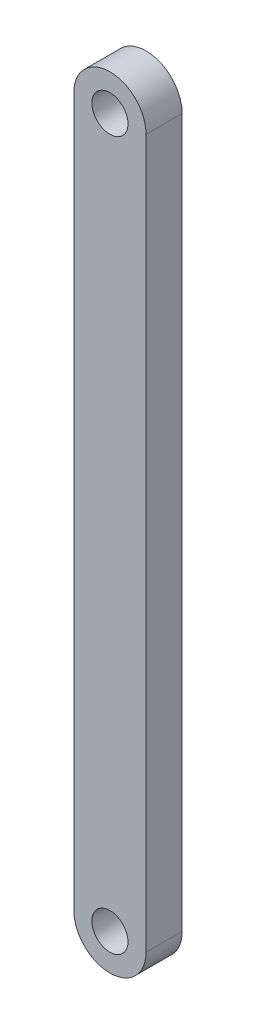
ISO-10303-21;
HEADER;
FILE_DESCRIPTION(('STEP AP214'),'2;1');
FILE_NAME('part.step','',(''),(''),'','','');
FILE_SCHEMA(('AUTOMOTIVE_DESIGN { 1 0 10303 214 1 1 1 1 }'));
ENDSEC;
DATA;
#1=APPLICATION_CONTEXT('core data for automotive mechanical design processes');
#2=APPLICATION_PROTOCOL_DEFINITION('international standard','automotive_design',2000,#1);
#3=PRODUCT_CONTEXT('',#1,'mechanical');
#4=PRODUCT('Part','Part','',(#3));
#5=PRODUCT_RELATED_PRODUCT_CATEGORY('part','',(#4));
#6=PRODUCT_DEFINITION_FORMATION('','',#4);
#7=PRODUCT_DEFINITION_CONTEXT('part definition',#1,'design');
#8=PRODUCT_DEFINITION('design','',#6,#7);
#9=PRODUCT_DEFINITION_SHAPE('','',#8);
#10=(LENGTH_UNIT() NAMED_UNIT(*) SI_UNIT(.MILLI.,.METRE.));
#11=(NAMED_UNIT(*) PLANE_ANGLE_UNIT() SI_UNIT($,.RADIAN.));
#12=(NAMED_UNIT(*) SI_UNIT($,.STERADIAN.) SOLID_ANGLE_UNIT());
#13=UNCERTAINTY_MEASURE_WITH_UNIT(LENGTH_MEASURE(1.E-05),#10,'distance_accuracy_value','');
#14=(GEOMETRIC_REPRESENTATION_CONTEXT(3) GLOBAL_UNCERTAINTY_ASSIGNED_CONTEXT((#13)) GLOBAL_UNIT_ASSIGNED_CONTEXT((#10,
#11,#12)) REPRESENTATION_CONTEXT('',''));
#15=CARTESIAN_POINT('',(0.,0.,0.));
#16=DIRECTION('',(0.,0.,1.));
#17=DIRECTION('',(1.,0.,0.));
#18=AXIS2_PLACEMENT_3D('',#15,#16,#17);
#19=CARTESIAN_POINT('',(0.,0.,6.));
#20=DIRECTION('',(0.,0.,1.));
#21=DIRECTION('',(1.,0.,0.));
#22=AXIS2_PLACEMENT_3D('',#19,#20,#21);
#23=PLANE('',#22);
#24=CARTESIAN_POINT('',(0.,0.,6.));
#25=DIRECTION('',(0.,0.,1.));
#26=DIRECTION('',(1.,0.,0.));
#27=AXIS2_PLACEMENT_3D('',#24,#25,#26);
#28=CIRCLE('',#27,3.);
#29=CARTESIAN_POINT('',(3.,0.,6.));
#30=VERTEX_POINT('',#29);
#31=EDGE_CURVE('E100',#30,#30,#28,.T.);
#32=ORIENTED_EDGE('',*,*,#31,.F.);
#33=EDGE_LOOP('',(#32));
#34=FACE_BOUND('',#33,.T.);
#35=CARTESIAN_POINT('',(0.,0.,6.));
#36=DIRECTION('',(0.,0.,1.));
#37=DIRECTION('',(1.,0.,0.));
#38=AXIS2_PLACEMENT_3D('',#35,#36,#37);
#39=CIRCLE('',#38,6.);
#40=CARTESIAN_POINT('',(-6.,0.,6.));
#41=VERTEX_POINT('',#40);
#42=CARTESIAN_POINT('',(6.,0.,6.));
#43=VERTEX_POINT('',#42);
#44=EDGE_CURVE('E85',#41,#43,#39,.T.);
#45=ORIENTED_EDGE('',*,*,#44,.T.);
#46=DIRECTION('',(0.,1.,0.));
#47=VECTOR('',#46,1.);
#48=CARTESIAN_POINT('',(6.,0.,6.));
#49=LINE('',#48,#47);
#50=CARTESIAN_POINT('',(6.,117.69,6.));
#51=VERTEX_POINT('',#50);
#52=EDGE_CURVE('E80',#43,#51,#49,.T.);
#53=ORIENTED_EDGE('',*,*,#52,.T.);
#54=CARTESIAN_POINT('',(0.,117.69,6.));
#55=DIRECTION('',(0.,0.,1.));
#56=DIRECTION('',(1.,0.,0.));
#57=AXIS2_PLACEMENT_3D('',#54,#55,#56);
#58=CIRCLE('',#57,6.);
#59=CARTESIAN_POINT('',(-6.,117.69,6.));
#60=VERTEX_POINT('',#59);
#61=EDGE_CURVE('E83',#51,#60,#58,.T.);
#62=ORIENTED_EDGE('',*,*,#61,.T.);
#63=DIRECTION('',(0.,-1.,0.));
#64=VECTOR('',#63,1.);
#65=CARTESIAN_POINT('',(-6.,0.,6.));
#66=LINE('',#65,#64);
#67=EDGE_CURVE('E50',#60,#41,#66,.T.);
#68=ORIENTED_EDGE('',*,*,#67,.T.);
#69=EDGE_LOOP('',(#45,#53,#62,#68));
#70=FACE_BOUND('',#69,.T.);
#71=CARTESIAN_POINT('',(0.,117.69,6.));
#72=DIRECTION('',(0.,0.,1.));
#73=DIRECTION('',(1.,0.,0.));
#74=AXIS2_PLACEMENT_3D('',#71,#72,#73);
#75=CIRCLE('',#74,3.);
#76=CARTESIAN_POINT('',(3.,117.69,6.));
#77=VERTEX_POINT('',#76);
#78=EDGE_CURVE('E115',#77,#77,#75,.T.);
#79=ORIENTED_EDGE('',*,*,#78,.F.);
#80=EDGE_LOOP('',(#79));
#81=FACE_BOUND('',#80,.T.);
#82=ADVANCED_FACE('F33',(#34,#70,#81),#23,.T.);
#83=CARTESIAN_POINT('',(0.,0.,0.));
#84=DIRECTION('',(0.,0.,1.));
#85=DIRECTION('',(1.,0.,0.));
#86=AXIS2_PLACEMENT_3D('',#83,#84,#85);
#87=PLANE('',#86);
#88=CARTESIAN_POINT('',(0.,0.,0.));
#89=DIRECTION('',(0.,0.,1.));
#90=DIRECTION('',(1.,0.,0.));
#91=AXIS2_PLACEMENT_3D('',#88,#89,#90);
#92=CIRCLE('',#91,6.);
#93=CARTESIAN_POINT('',(-6.,0.,0.));
#94=VERTEX_POINT('',#93);
#95=CARTESIAN_POINT('',(6.,0.,0.));
#96=VERTEX_POINT('',#95);
#97=EDGE_CURVE('E97',#94,#96,#92,.T.);
#98=ORIENTED_EDGE('',*,*,#97,.F.);
#99=DIRECTION('',(0.,-1.,0.));
#100=VECTOR('',#99,1.);
#101=CARTESIAN_POINT('',(-6.,0.,0.));
#102=LINE('',#101,#100);
#103=CARTESIAN_POINT('',(-6.,117.69,0.));
#104=VERTEX_POINT('',#103);
#105=EDGE_CURVE('E73',#104,#94,#102,.T.);
#106=ORIENTED_EDGE('',*,*,#105,.F.);
#107=CARTESIAN_POINT('',(0.,117.69,0.));
#108=DIRECTION('',(0.,0.,1.));
#109=DIRECTION('',(1.,0.,0.));
#110=AXIS2_PLACEMENT_3D('',#107,#108,#109);
#111=CIRCLE('',#110,6.);
#112=CARTESIAN_POINT('',(6.,117.69,0.));
#113=VERTEX_POINT('',#112);
#114=EDGE_CURVE('E67',#113,#104,#111,.T.);
#115=ORIENTED_EDGE('',*,*,#114,.F.);
#116=DIRECTION('',(0.,1.,0.));
#117=VECTOR('',#116,1.);
#118=CARTESIAN_POINT('',(6.,0.,0.));
#119=LINE('',#118,#117);
#120=EDGE_CURVE('E89',#96,#113,#119,.T.);
#121=ORIENTED_EDGE('',*,*,#120,.F.);
#122=EDGE_LOOP('',(#98,#106,#115,#121));
#123=FACE_BOUND('',#122,.T.);
#124=CARTESIAN_POINT('',(0.,0.,0.));
#125=DIRECTION('',(0.,0.,1.));
#126=DIRECTION('',(1.,0.,0.));
#127=AXIS2_PLACEMENT_3D('',#124,#125,#126);
#128=CIRCLE('',#127,3.);
#129=CARTESIAN_POINT('',(3.,0.,0.));
#130=VERTEX_POINT('',#129);
#131=EDGE_CURVE('E112',#130,#130,#128,.T.);
#132=ORIENTED_EDGE('',*,*,#131,.T.);
#133=EDGE_LOOP('',(#132));
#134=FACE_BOUND('',#133,.T.);
#135=CARTESIAN_POINT('',(0.,117.69,0.));
#136=DIRECTION('',(0.,0.,1.));
#137=DIRECTION('',(1.,0.,0.));
#138=AXIS2_PLACEMENT_3D('',#135,#136,#137);
#139=CIRCLE('',#138,3.);
#140=CARTESIAN_POINT('',(3.,117.69,0.));
#141=VERTEX_POINT('',#140);
#142=EDGE_CURVE('E118',#141,#141,#139,.T.);
#143=ORIENTED_EDGE('',*,*,#142,.T.);
#144=EDGE_LOOP('',(#143));
#145=FACE_BOUND('',#144,.T.);
#146=ADVANCED_FACE('F108',(#123,#134,#145),#87,.F.);
#147=CARTESIAN_POINT('',(0.,0.,6.));
#148=DIRECTION('',(0.,0.,-1.));
#149=DIRECTION('',(-1.,0.,0.));
#150=AXIS2_PLACEMENT_3D('',#147,#148,#149);
#151=CYLINDRICAL_SURFACE('',#150,6.);
#152=ORIENTED_EDGE('',*,*,#97,.T.);
#153=DIRECTION('',(0.,0.,-1.));
#154=VECTOR('',#153,1.);
#155=CARTESIAN_POINT('',(6.,0.,6.));
#156=LINE('',#155,#154);
#157=EDGE_CURVE('E11',#43,#96,#156,.T.);
#158=ORIENTED_EDGE('',*,*,#157,.F.);
#159=ORIENTED_EDGE('',*,*,#44,.F.);
#160=DIRECTION('',(0.,0.,-1.));
#161=VECTOR('',#160,1.);
#162=CARTESIAN_POINT('',(-6.,0.,6.));
#163=LINE('',#162,#161);
#164=EDGE_CURVE('E93',#41,#94,#163,.T.);
#165=ORIENTED_EDGE('',*,*,#164,.T.);
#166=EDGE_LOOP('',(#152,#158,#159,#165));
#167=FACE_BOUND('',#166,.T.);
#168=ADVANCED_FACE('F35',(#167),#151,.T.);
#169=CARTESIAN_POINT('',(6.,0.,6.));
#170=DIRECTION('',(-1.,0.,0.));
#171=DIRECTION('',(0.,0.,1.));
#172=AXIS2_PLACEMENT_3D('',#169,#170,#171);
#173=PLANE('',#172);
#174=ORIENTED_EDGE('',*,*,#120,.T.);
#175=DIRECTION('',(0.,0.,-1.));
#176=VECTOR('',#175,1.);
#177=CARTESIAN_POINT('',(6.,117.69,6.));
#178=LINE('',#177,#176);
#179=EDGE_CURVE('E42',#51,#113,#178,.T.);
#180=ORIENTED_EDGE('',*,*,#179,.F.);
#181=ORIENTED_EDGE('',*,*,#52,.F.);
#182=ORIENTED_EDGE('',*,*,#157,.T.);
#183=EDGE_LOOP('',(#174,#180,#181,#182));
#184=FACE_BOUND('',#183,.T.);
#185=ADVANCED_FACE('F88',(#184),#173,.F.);
#186=CARTESIAN_POINT('',(0.,117.69,6.));
#187=DIRECTION('',(0.,0.,-1.));
#188=DIRECTION('',(-1.,0.,0.));
#189=AXIS2_PLACEMENT_3D('',#186,#187,#188);
#190=CYLINDRICAL_SURFACE('',#189,6.);
#191=ORIENTED_EDGE('',*,*,#114,.T.);
#192=DIRECTION('',(0.,0.,-1.));
#193=VECTOR('',#192,1.);
#194=CARTESIAN_POINT('',(-6.,117.69,6.));
#195=LINE('',#194,#193);
#196=EDGE_CURVE('E90',#60,#104,#195,.T.);
#197=ORIENTED_EDGE('',*,*,#196,.F.);
#198=ORIENTED_EDGE('',*,*,#61,.F.);
#199=ORIENTED_EDGE('',*,*,#179,.T.);
#200=EDGE_LOOP('',(#191,#197,#198,#199));
#201=FACE_BOUND('',#200,.T.);
#202=ADVANCED_FACE('F91',(#201),#190,.T.);
#203=CARTESIAN_POINT('',(-6.,0.,6.));
#204=DIRECTION('',(1.,0.,0.));
#205=DIRECTION('',(0.,0.,-1.));
#206=AXIS2_PLACEMENT_3D('',#203,#204,#205);
#207=PLANE('',#206);
#208=ORIENTED_EDGE('',*,*,#105,.T.);
#209=ORIENTED_EDGE('',*,*,#164,.F.);
#210=ORIENTED_EDGE('',*,*,#67,.F.);
#211=ORIENTED_EDGE('',*,*,#196,.T.);
#212=EDGE_LOOP('',(#208,#209,#210,#211));
#213=FACE_BOUND('',#212,.T.);
#214=ADVANCED_FACE('F105',(#213),#207,.F.);
#215=CARTESIAN_POINT('',(0.,0.,6.));
#216=DIRECTION('',(0.,0.,-1.));
#217=DIRECTION('',(-1.,0.,0.));
#218=AXIS2_PLACEMENT_3D('',#215,#216,#217);
#219=CYLINDRICAL_SURFACE('',#218,3.);
#220=ORIENTED_EDGE('',*,*,#31,.T.);
#221=EDGE_LOOP('',(#220));
#222=FACE_BOUND('',#221,.T.);
#223=ORIENTED_EDGE('',*,*,#131,.F.);
#224=EDGE_LOOP('',(#223));
#225=FACE_BOUND('',#224,.T.);
#226=ADVANCED_FACE('F135',(#222,#225),#219,.F.);
#227=CARTESIAN_POINT('',(0.,117.69,6.));
#228=DIRECTION('',(0.,0.,-1.));
#229=DIRECTION('',(-1.,0.,0.));
#230=AXIS2_PLACEMENT_3D('',#227,#228,#229);
#231=CYLINDRICAL_SURFACE('',#230,3.);
#232=ORIENTED_EDGE('',*,*,#78,.T.);
#233=EDGE_LOOP('',(#232));
#234=FACE_BOUND('',#233,.T.);
#235=ORIENTED_EDGE('',*,*,#142,.F.);
#236=EDGE_LOOP('',(#235));
#237=FACE_BOUND('',#236,.T.);
#238=ADVANCED_FACE('F124',(#234,#237),#231,.F.);
#239=CLOSED_SHELL('',(#82,#146,#168,#185,#202,#214,#226,#238));
#240=MANIFOLD_SOLID_BREP('B2',#239);
#241=ADVANCED_BREP_SHAPE_REPRESENTATION('',(#18,#240),#14);
#242=SHAPE_DEFINITION_REPRESENTATION(#9,#241);
ENDSEC;
END-ISO-10303-21;
